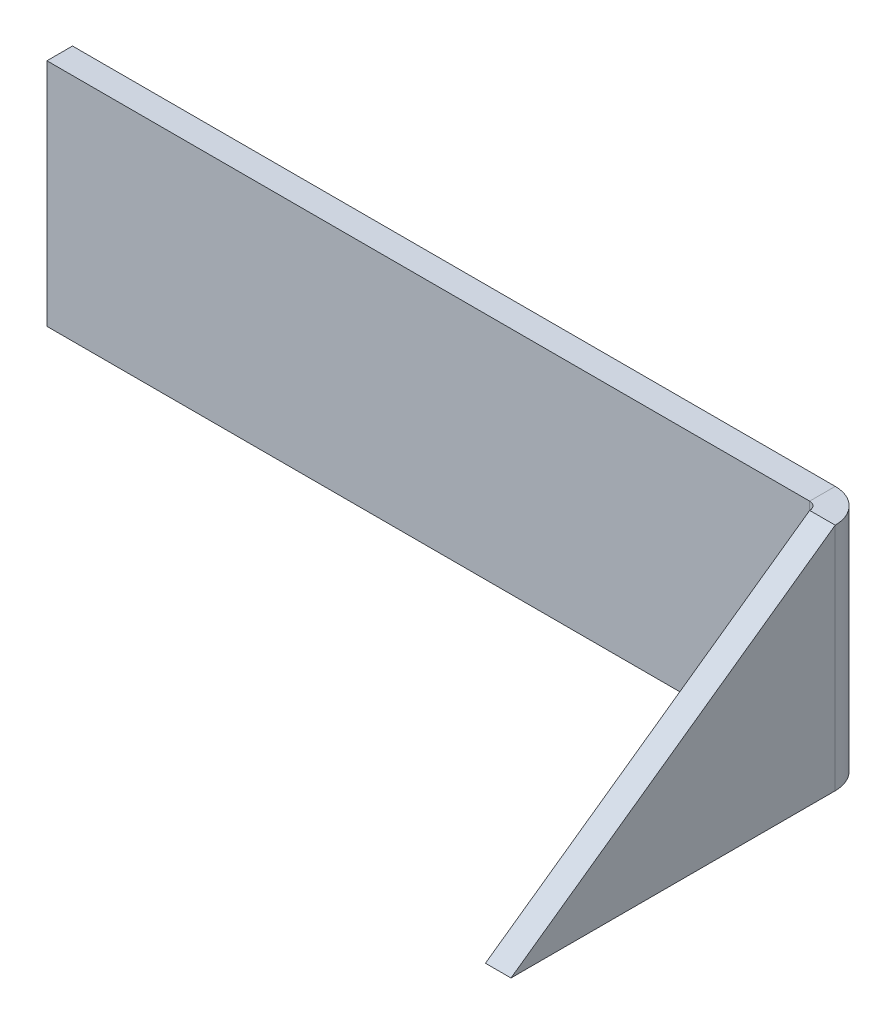
ISO-10303-21;
HEADER;
FILE_DESCRIPTION(('STEP AP214'),'2;1');
FILE_NAME('part.step','',(''),(''),'','','');
FILE_SCHEMA(('AUTOMOTIVE_DESIGN { 1 0 10303 214 1 1 1 1 }'));
ENDSEC;
DATA;
#1=APPLICATION_CONTEXT('core data for automotive mechanical design processes');
#2=APPLICATION_PROTOCOL_DEFINITION('international standard','automotive_design',2000,#1);
#3=PRODUCT_CONTEXT('',#1,'mechanical');
#4=PRODUCT('Part','Part','',(#3));
#5=PRODUCT_RELATED_PRODUCT_CATEGORY('part','',(#4));
#6=PRODUCT_DEFINITION_FORMATION('','',#4);
#7=PRODUCT_DEFINITION_CONTEXT('part definition',#1,'design');
#8=PRODUCT_DEFINITION('design','',#6,#7);
#9=PRODUCT_DEFINITION_SHAPE('','',#8);
#10=(LENGTH_UNIT() NAMED_UNIT(*) SI_UNIT(.MILLI.,.METRE.));
#11=(NAMED_UNIT(*) PLANE_ANGLE_UNIT() SI_UNIT($,.RADIAN.));
#12=(NAMED_UNIT(*) SI_UNIT($,.STERADIAN.) SOLID_ANGLE_UNIT());
#13=UNCERTAINTY_MEASURE_WITH_UNIT(LENGTH_MEASURE(1.E-05),#10,'distance_accuracy_value','');
#14=(GEOMETRIC_REPRESENTATION_CONTEXT(3) GLOBAL_UNCERTAINTY_ASSIGNED_CONTEXT((#13)) GLOBAL_UNIT_ASSIGNED_CONTEXT((#10,
#11,#12)) REPRESENTATION_CONTEXT('',''));
#15=CARTESIAN_POINT('',(0.,0.,0.));
#16=DIRECTION('',(0.,0.,1.));
#17=DIRECTION('',(1.,0.,0.));
#18=AXIS2_PLACEMENT_3D('',#15,#16,#17);
#19=CARTESIAN_POINT('',(-47.371,14.2875,3.175));
#20=DIRECTION('',(0.,-1.,0.));
#21=DIRECTION('',(0.,0.,-1.));
#22=AXIS2_PLACEMENT_3D('',#19,#20,#21);
#23=PLANE('',#22);
#24=DIRECTION('',(-1.,0.,0.));
#25=VECTOR('',#24,1.);
#26=CARTESIAN_POINT('',(-47.371,14.2875,0.));
#27=LINE('',#26,#25);
#28=CARTESIAN_POINT('',(47.371,14.2875,0.));
#29=VERTEX_POINT('',#28);
#30=CARTESIAN_POINT('',(-47.371,14.2875,0.));
#31=VERTEX_POINT('',#30);
#32=EDGE_CURVE('E176',#29,#31,#27,.T.);
#33=ORIENTED_EDGE('',*,*,#32,.T.);
#34=DIRECTION('',(0.,0.,-1.));
#35=VECTOR('',#34,1.);
#36=CARTESIAN_POINT('',(-47.371,14.2875,3.175));
#37=LINE('',#36,#35);
#38=CARTESIAN_POINT('',(-47.371,14.2875,3.175));
#39=VERTEX_POINT('',#38);
#40=EDGE_CURVE('E65',#39,#31,#37,.T.);
#41=ORIENTED_EDGE('',*,*,#40,.F.);
#42=DIRECTION('',(-1.,0.,0.));
#43=VECTOR('',#42,1.);
#44=CARTESIAN_POINT('',(-47.371,14.2875,3.175));
#45=LINE('',#44,#43);
#46=CARTESIAN_POINT('',(47.371,14.2875,3.175));
#47=VERTEX_POINT('',#46);
#48=EDGE_CURVE('E101',#47,#39,#45,.T.);
#49=ORIENTED_EDGE('',*,*,#48,.F.);
#50=DIRECTION('',(0.,0.,-1.));
#51=VECTOR('',#50,1.);
#52=CARTESIAN_POINT('',(47.371,14.2875,3.175));
#53=LINE('',#52,#51);
#54=EDGE_CURVE('E13',#47,#29,#53,.T.);
#55=ORIENTED_EDGE('',*,*,#54,.T.);
#56=EDGE_LOOP('',(#33,#41,#49,#55));
#57=FACE_BOUND('',#56,.T.);
#58=ADVANCED_FACE('F57',(#57),#23,.F.);
#59=CARTESIAN_POINT('',(-47.371,14.2875,3.175));
#60=DIRECTION('',(1.,0.,0.));
#61=DIRECTION('',(0.,0.,-1.));
#62=AXIS2_PLACEMENT_3D('',#59,#60,#61);
#63=PLANE('',#62);
#64=DIRECTION('',(0.,-1.,0.));
#65=VECTOR('',#64,1.);
#66=CARTESIAN_POINT('',(-47.371,14.2875,0.));
#67=LINE('',#66,#65);
#68=CARTESIAN_POINT('',(-47.371,-14.2875,0.));
#69=VERTEX_POINT('',#68);
#70=EDGE_CURVE('E88',#31,#69,#67,.T.);
#71=ORIENTED_EDGE('',*,*,#70,.T.);
#72=DIRECTION('',(0.,0.,-1.));
#73=VECTOR('',#72,1.);
#74=CARTESIAN_POINT('',(-47.371,-14.2875,3.175));
#75=LINE('',#74,#73);
#76=CARTESIAN_POINT('',(-47.371,-14.2875,3.175));
#77=VERTEX_POINT('',#76);
#78=EDGE_CURVE('E183',#77,#69,#75,.T.);
#79=ORIENTED_EDGE('',*,*,#78,.F.);
#80=DIRECTION('',(0.,-1.,0.));
#81=VECTOR('',#80,1.);
#82=CARTESIAN_POINT('',(-47.371,14.2875,3.175));
#83=LINE('',#82,#81);
#84=EDGE_CURVE('E169',#39,#77,#83,.T.);
#85=ORIENTED_EDGE('',*,*,#84,.F.);
#86=ORIENTED_EDGE('',*,*,#40,.T.);
#87=EDGE_LOOP('',(#71,#79,#85,#86));
#88=FACE_BOUND('',#87,.T.);
#89=ADVANCED_FACE('F185',(#88),#63,.F.);
#90=CARTESIAN_POINT('',(-47.371,-14.2875,3.175));
#91=DIRECTION('',(0.,1.,0.));
#92=DIRECTION('',(0.,0.,1.));
#93=AXIS2_PLACEMENT_3D('',#90,#91,#92);
#94=PLANE('',#93);
#95=DIRECTION('',(1.,0.,0.));
#96=VECTOR('',#95,1.);
#97=CARTESIAN_POINT('',(-47.371,-14.2875,0.));
#98=LINE('',#97,#96);
#99=CARTESIAN_POINT('',(47.371,-14.2875,0.));
#100=VERTEX_POINT('',#99);
#101=EDGE_CURVE('E94',#69,#100,#98,.T.);
#102=ORIENTED_EDGE('',*,*,#101,.T.);
#103=DIRECTION('',(0.,0.,-1.));
#104=VECTOR('',#103,1.);
#105=CARTESIAN_POINT('',(47.371,-14.2875,3.175));
#106=LINE('',#105,#104);
#107=CARTESIAN_POINT('',(47.371,-14.2875,3.175));
#108=VERTEX_POINT('',#107);
#109=EDGE_CURVE('E172',#108,#100,#106,.T.);
#110=ORIENTED_EDGE('',*,*,#109,.F.);
#111=DIRECTION('',(1.,0.,0.));
#112=VECTOR('',#111,1.);
#113=CARTESIAN_POINT('',(-47.371,-14.2875,3.175));
#114=LINE('',#113,#112);
#115=EDGE_CURVE('E73',#77,#108,#114,.T.);
#116=ORIENTED_EDGE('',*,*,#115,.F.);
#117=ORIENTED_EDGE('',*,*,#78,.T.);
#118=EDGE_LOOP('',(#102,#110,#116,#117));
#119=FACE_BOUND('',#118,.T.);
#120=ADVANCED_FACE('F222',(#119),#94,.F.);
#121=CARTESIAN_POINT('',(0.,0.,3.175));
#122=DIRECTION('',(0.,0.,1.));
#123=DIRECTION('',(1.,0.,0.));
#124=AXIS2_PLACEMENT_3D('',#121,#122,#123);
#125=PLANE('',#124);
#126=DIRECTION('',(0.,1.,0.));
#127=VECTOR('',#126,1.);
#128=CARTESIAN_POINT('',(47.371,14.2875,3.175));
#129=LINE('',#128,#127);
#130=EDGE_CURVE('E166',#108,#47,#129,.T.);
#131=ORIENTED_EDGE('',*,*,#130,.T.);
#132=ORIENTED_EDGE('',*,*,#48,.T.);
#133=ORIENTED_EDGE('',*,*,#84,.T.);
#134=ORIENTED_EDGE('',*,*,#115,.T.);
#135=EDGE_LOOP('',(#131,#132,#133,#134));
#136=FACE_BOUND('',#135,.T.);
#137=ADVANCED_FACE('F226',(#136),#125,.T.);
#138=CARTESIAN_POINT('',(0.,0.,0.));
#139=DIRECTION('',(0.,0.,1.));
#140=DIRECTION('',(1.,0.,0.));
#141=AXIS2_PLACEMENT_3D('',#138,#139,#140);
#142=PLANE('',#141);
#143=DIRECTION('',(0.,1.,0.));
#144=VECTOR('',#143,1.);
#145=CARTESIAN_POINT('',(47.371,14.2875,0.));
#146=LINE('',#145,#144);
#147=EDGE_CURVE('E173',#100,#29,#146,.T.);
#148=ORIENTED_EDGE('',*,*,#147,.F.);
#149=ORIENTED_EDGE('',*,*,#101,.F.);
#150=ORIENTED_EDGE('',*,*,#70,.F.);
#151=ORIENTED_EDGE('',*,*,#32,.F.);
#152=EDGE_LOOP('',(#148,#149,#150,#151));
#153=FACE_BOUND('',#152,.T.);
#154=ADVANCED_FACE('F188',(#153),#142,.F.);
#155=CARTESIAN_POINT('',(47.371,-14.2875,4.17499999999999));
#156=DIRECTION('',(0.,-1.,0.));
#157=DIRECTION('',(0.,0.,-1.));
#158=AXIS2_PLACEMENT_3D('',#155,#156,#157);
#159=PLANE('',#158);
#160=DIRECTION('',(-1.,0.,0.));
#161=VECTOR('',#160,1.);
#162=CARTESIAN_POINT('',(51.546,-14.2875,4.17499999999998));
#163=LINE('',#162,#161);
#164=CARTESIAN_POINT('',(48.371,-14.2875,4.17499999999999));
#165=VERTEX_POINT('',#164);
#166=CARTESIAN_POINT('',(51.546,-14.2875,4.17499999999998));
#167=VERTEX_POINT('',#166);
#168=EDGE_CURVE('E145',#165,#167,#163,.F.);
#169=ORIENTED_EDGE('',*,*,#168,.F.);
#170=CARTESIAN_POINT('',(47.371,-14.2875,4.17499999999999));
#171=DIRECTION('',(0.,1.,0.));
#172=DIRECTION('',(0.,0.,1.));
#173=AXIS2_PLACEMENT_3D('',#170,#171,#172);
#174=CIRCLE('',#173,1.00000000000001);
#175=EDGE_CURVE('E154',#108,#165,#174,.F.);
#176=ORIENTED_EDGE('',*,*,#175,.F.);
#177=ORIENTED_EDGE('',*,*,#109,.T.);
#178=CARTESIAN_POINT('',(47.371,-14.2875,4.17499999999999));
#179=DIRECTION('',(0.,1.,0.));
#180=DIRECTION('',(0.,0.,1.));
#181=AXIS2_PLACEMENT_3D('',#178,#179,#180);
#182=CIRCLE('',#181,4.17500000000001);
#183=EDGE_CURVE('E177',#100,#167,#182,.F.);
#184=ORIENTED_EDGE('',*,*,#183,.T.);
#185=EDGE_LOOP('',(#169,#176,#177,#184));
#186=FACE_BOUND('',#185,.T.);
#187=ADVANCED_FACE('F193',(#186),#159,.T.);
#188=CARTESIAN_POINT('',(47.371,14.2875,4.17499999999999));
#189=DIRECTION('',(0.,-1.,0.));
#190=DIRECTION('',(0.,0.,-1.));
#191=AXIS2_PLACEMENT_3D('',#188,#189,#190);
#192=PLANE('',#191);
#193=CARTESIAN_POINT('',(47.371,14.2875,4.17499999999999));
#194=DIRECTION('',(0.,1.,0.));
#195=DIRECTION('',(0.,0.,1.));
#196=AXIS2_PLACEMENT_3D('',#193,#194,#195);
#197=CIRCLE('',#196,1.00000000000001);
#198=CARTESIAN_POINT('',(48.371,14.2875,4.17499999999999));
#199=VERTEX_POINT('',#198);
#200=EDGE_CURVE('E152',#199,#47,#197,.T.);
#201=ORIENTED_EDGE('',*,*,#200,.F.);
#202=DIRECTION('',(-1.,0.,0.));
#203=VECTOR('',#202,1.);
#204=CARTESIAN_POINT('',(48.371,14.2875,4.17499999999999));
#205=LINE('',#204,#203);
#206=CARTESIAN_POINT('',(51.546,14.2875,4.17499999999998));
#207=VERTEX_POINT('',#206);
#208=EDGE_CURVE('E123',#199,#207,#205,.F.);
#209=ORIENTED_EDGE('',*,*,#208,.T.);
#210=CARTESIAN_POINT('',(47.371,14.2875,4.17499999999999));
#211=DIRECTION('',(0.,1.,0.));
#212=DIRECTION('',(0.,0.,1.));
#213=AXIS2_PLACEMENT_3D('',#210,#211,#212);
#214=CIRCLE('',#213,4.17500000000001);
#215=EDGE_CURVE('E160',#207,#29,#214,.T.);
#216=ORIENTED_EDGE('',*,*,#215,.T.);
#217=ORIENTED_EDGE('',*,*,#54,.F.);
#218=EDGE_LOOP('',(#201,#209,#216,#217));
#219=FACE_BOUND('',#218,.T.);
#220=ADVANCED_FACE('F157',(#219),#192,.F.);
#221=CARTESIAN_POINT('',(47.371,14.2875,4.17499999999999));
#222=DIRECTION('',(0.,1.,0.));
#223=DIRECTION('',(1.,0.,0.));
#224=AXIS2_PLACEMENT_3D('',#221,#222,#223);
#225=CYLINDRICAL_SURFACE('',#224,4.17500000000001);
#226=ORIENTED_EDGE('',*,*,#147,.T.);
#227=ORIENTED_EDGE('',*,*,#215,.F.);
#228=DIRECTION('',(0.,1.,0.));
#229=VECTOR('',#228,1.);
#230=CARTESIAN_POINT('',(51.546,-14.2875,4.17499999999998));
#231=LINE('',#230,#229);
#232=EDGE_CURVE('E135',#207,#167,#231,.F.);
#233=ORIENTED_EDGE('',*,*,#232,.T.);
#234=ORIENTED_EDGE('',*,*,#183,.F.);
#235=EDGE_LOOP('',(#226,#227,#233,#234));
#236=FACE_BOUND('',#235,.T.);
#237=ADVANCED_FACE('F195',(#236),#225,.T.);
#238=CARTESIAN_POINT('',(47.371,14.2875,4.17499999999999));
#239=DIRECTION('',(0.,1.,0.));
#240=DIRECTION('',(1.,0.,0.));
#241=AXIS2_PLACEMENT_3D('',#238,#239,#240);
#242=CYLINDRICAL_SURFACE('',#241,1.00000000000001);
#243=ORIENTED_EDGE('',*,*,#130,.F.);
#244=ORIENTED_EDGE('',*,*,#175,.T.);
#245=DIRECTION('',(0.,1.,0.));
#246=VECTOR('',#245,1.);
#247=CARTESIAN_POINT('',(48.371,-14.2875,4.17499999999999));
#248=LINE('',#247,#246);
#249=EDGE_CURVE('E136',#165,#199,#248,.T.);
#250=ORIENTED_EDGE('',*,*,#249,.T.);
#251=ORIENTED_EDGE('',*,*,#200,.T.);
#252=EDGE_LOOP('',(#243,#244,#250,#251));
#253=FACE_BOUND('',#252,.T.);
#254=ADVANCED_FACE('F151',(#253),#242,.F.);
#255=CARTESIAN_POINT('',(51.546,-14.2875,3.17499999999999));
#256=DIRECTION('',(0.,1.,0.));
#257=DIRECTION('',(0.,0.,1.));
#258=AXIS2_PLACEMENT_3D('',#255,#256,#257);
#259=PLANE('',#258);
#260=ORIENTED_EDGE('',*,*,#168,.T.);
#261=DIRECTION('',(0.,0.,-1.));
#262=VECTOR('',#261,1.);
#263=CARTESIAN_POINT('',(51.546,-14.2875,-1.71117697117709E-13));
#264=LINE('',#263,#262);
#265=CARTESIAN_POINT('',(51.5460000000001,-14.2875,44.45));
#266=VERTEX_POINT('',#265);
#267=EDGE_CURVE('E162',#266,#167,#264,.T.);
#268=ORIENTED_EDGE('',*,*,#267,.F.);
#269=DIRECTION('',(-1.,0.,0.));
#270=VECTOR('',#269,1.);
#271=CARTESIAN_POINT('',(51.5460000000002,-14.2875,44.45));
#272=LINE('',#271,#270);
#273=CARTESIAN_POINT('',(48.3710000000002,-14.2875,44.45));
#274=VERTEX_POINT('',#273);
#275=EDGE_CURVE('E158',#266,#274,#272,.T.);
#276=ORIENTED_EDGE('',*,*,#275,.T.);
#277=DIRECTION('',(0.,0.,1.));
#278=VECTOR('',#277,1.);
#279=CARTESIAN_POINT('',(48.371,-14.2875,3.175));
#280=LINE('',#279,#278);
#281=EDGE_CURVE('E144',#274,#165,#280,.F.);
#282=ORIENTED_EDGE('',*,*,#281,.T.);
#283=EDGE_LOOP('',(#260,#268,#276,#282));
#284=FACE_BOUND('',#283,.T.);
#285=ADVANCED_FACE('F207',(#284),#259,.F.);
#286=CARTESIAN_POINT('',(51.546,0.,-1.78323471556382E-13));
#287=DIRECTION('',(-1.,0.,0.));
#288=DIRECTION('',(0.,0.,1.));
#289=AXIS2_PLACEMENT_3D('',#286,#287,#288);
#290=PLANE('',#289);
#291=ORIENTED_EDGE('',*,*,#232,.F.);
#292=DIRECTION('',(0.,0.578649254314194,-0.815576508049139));
#293=VECTOR('',#292,1.);
#294=CARTESIAN_POINT('',(51.546,11.4738646979449,8.14067495329031));
#295=LINE('',#294,#293);
#296=EDGE_CURVE('E129',#266,#207,#295,.T.);
#297=ORIENTED_EDGE('',*,*,#296,.F.);
#298=ORIENTED_EDGE('',*,*,#267,.T.);
#299=EDGE_LOOP('',(#291,#297,#298));
#300=FACE_BOUND('',#299,.T.);
#301=ADVANCED_FACE('F205',(#300),#290,.F.);
#302=CARTESIAN_POINT('',(48.371,0.,-1.67238018305555E-13));
#303=DIRECTION('',(-1.,0.,0.));
#304=DIRECTION('',(0.,0.,1.));
#305=AXIS2_PLACEMENT_3D('',#302,#303,#304);
#306=PLANE('',#305);
#307=DIRECTION('',(0.,0.578649254314194,-0.815576508049139));
#308=VECTOR('',#307,1.);
#309=CARTESIAN_POINT('',(48.371,11.4738646979449,8.14067495329032));
#310=LINE('',#309,#308);
#311=EDGE_CURVE('E126',#274,#199,#310,.T.);
#312=ORIENTED_EDGE('',*,*,#311,.T.);
#313=ORIENTED_EDGE('',*,*,#249,.F.);
#314=ORIENTED_EDGE('',*,*,#281,.F.);
#315=EDGE_LOOP('',(#312,#313,#314));
#316=FACE_BOUND('',#315,.T.);
#317=ADVANCED_FACE('F142',(#316),#306,.T.);
#318=CARTESIAN_POINT('',(48.371,11.4738646979449,8.14067495329032));
#319=DIRECTION('',(0.,-0.815576508049139,-0.578649254314194));
#320=DIRECTION('',(0.,0.578649254314194,-0.815576508049139));
#321=AXIS2_PLACEMENT_3D('',#318,#319,#320);
#322=PLANE('',#321);
#323=ORIENTED_EDGE('',*,*,#296,.T.);
#324=ORIENTED_EDGE('',*,*,#208,.F.);
#325=ORIENTED_EDGE('',*,*,#311,.F.);
#326=ORIENTED_EDGE('',*,*,#275,.F.);
#327=EDGE_LOOP('',(#323,#324,#325,#326));
#328=FACE_BOUND('',#327,.T.);
#329=ADVANCED_FACE('F125',(#328),#322,.F.);
#330=CLOSED_SHELL('',(#58,#89,#120,#137,#154,#187,#220,#237,#254,#285,#301,#317,#329));
#331=MANIFOLD_SOLID_BREP('B2',#330);
#332=ADVANCED_BREP_SHAPE_REPRESENTATION('',(#18,#331),#14);
#333=SHAPE_DEFINITION_REPRESENTATION(#9,#332);
ENDSEC;
END-ISO-10303-21;
